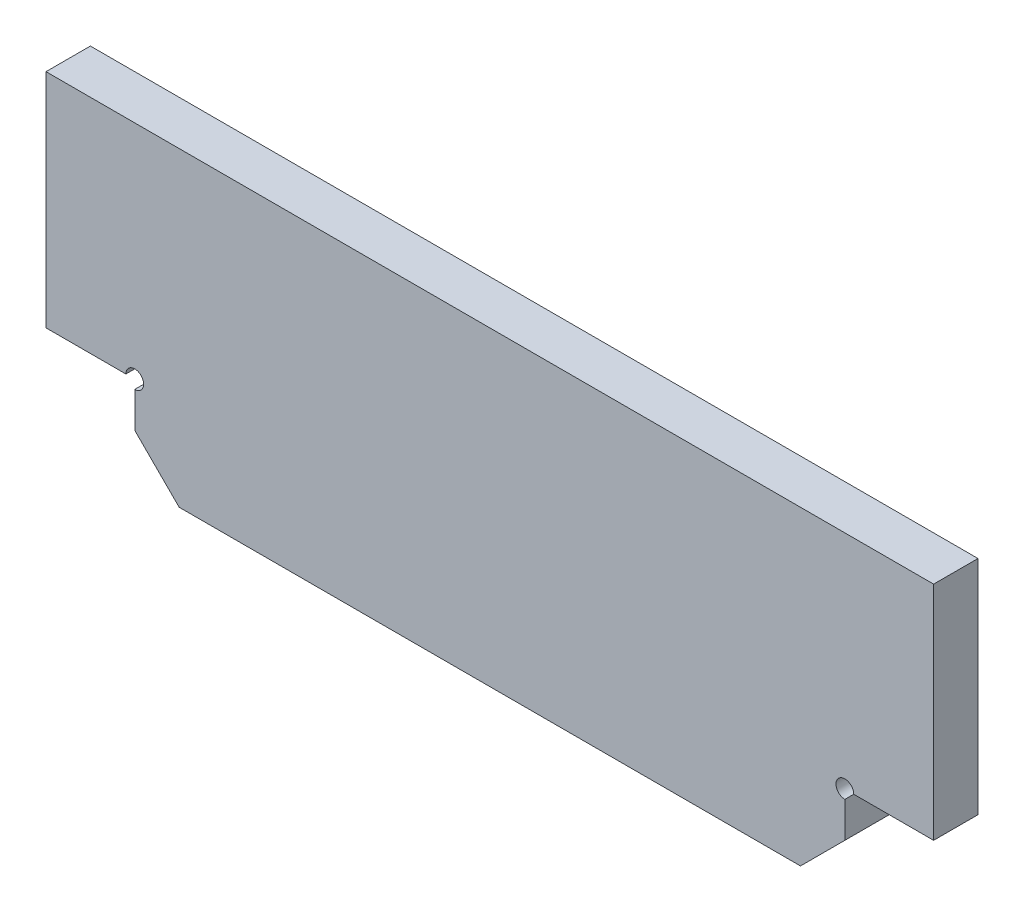
ISO-10303-21;
HEADER;
FILE_DESCRIPTION(('STEP AP214'),'2;1');
FILE_NAME('part.step','',(''),(''),'','','');
FILE_SCHEMA(('AUTOMOTIVE_DESIGN { 1 0 10303 214 1 1 1 1 }'));
ENDSEC;
DATA;
#1=APPLICATION_CONTEXT('core data for automotive mechanical design processes');
#2=APPLICATION_PROTOCOL_DEFINITION('international standard','automotive_design',2000,#1);
#3=PRODUCT_CONTEXT('',#1,'mechanical');
#4=PRODUCT('Part','Part','',(#3));
#5=PRODUCT_RELATED_PRODUCT_CATEGORY('part','',(#4));
#6=PRODUCT_DEFINITION_FORMATION('','',#4);
#7=PRODUCT_DEFINITION_CONTEXT('part definition',#1,'design');
#8=PRODUCT_DEFINITION('design','',#6,#7);
#9=PRODUCT_DEFINITION_SHAPE('','',#8);
#10=(LENGTH_UNIT() NAMED_UNIT(*) SI_UNIT(.MILLI.,.METRE.));
#11=(NAMED_UNIT(*) PLANE_ANGLE_UNIT() SI_UNIT($,.RADIAN.));
#12=(NAMED_UNIT(*) SI_UNIT($,.STERADIAN.) SOLID_ANGLE_UNIT());
#13=UNCERTAINTY_MEASURE_WITH_UNIT(LENGTH_MEASURE(1.E-05),#10,'distance_accuracy_value','');
#14=(GEOMETRIC_REPRESENTATION_CONTEXT(3) GLOBAL_UNCERTAINTY_ASSIGNED_CONTEXT((#13)) GLOBAL_UNIT_ASSIGNED_CONTEXT((#10,
#11,#12)) REPRESENTATION_CONTEXT('',''));
#15=CARTESIAN_POINT('',(0.,0.,0.));
#16=DIRECTION('',(0.,0.,1.));
#17=DIRECTION('',(1.,0.,0.));
#18=AXIS2_PLACEMENT_3D('',#15,#16,#17);
#19=CARTESIAN_POINT('',(50.,9.99999999999999,2.5));
#20=DIRECTION('',(-1.,0.,0.));
#21=DIRECTION('',(0.,0.,1.));
#22=AXIS2_PLACEMENT_3D('',#19,#20,#21);
#23=PLANE('',#22);
#24=DIRECTION('',(0.,1.,0.));
#25=VECTOR('',#24,1.);
#26=CARTESIAN_POINT('',(50.,9.99999999999999,-2.5));
#27=LINE('',#26,#25);
#28=CARTESIAN_POINT('',(50.,9.99999999999999,-2.5));
#29=VERTEX_POINT('',#28);
#30=CARTESIAN_POINT('',(50.,35.,-2.5));
#31=VERTEX_POINT('',#30);
#32=EDGE_CURVE('E152',#29,#31,#27,.T.);
#33=ORIENTED_EDGE('',*,*,#32,.T.);
#34=DIRECTION('',(0.,0.,-1.));
#35=VECTOR('',#34,1.);
#36=CARTESIAN_POINT('',(50.,35.,2.5));
#37=LINE('',#36,#35);
#38=CARTESIAN_POINT('',(50.,35.,2.5));
#39=VERTEX_POINT('',#38);
#40=EDGE_CURVE('E11',#39,#31,#37,.T.);
#41=ORIENTED_EDGE('',*,*,#40,.F.);
#42=DIRECTION('',(0.,1.,0.));
#43=VECTOR('',#42,1.);
#44=CARTESIAN_POINT('',(50.,9.99999999999999,2.5));
#45=LINE('',#44,#43);
#46=CARTESIAN_POINT('',(50.,9.99999999999999,2.5));
#47=VERTEX_POINT('',#46);
#48=EDGE_CURVE('E180',#47,#39,#45,.T.);
#49=ORIENTED_EDGE('',*,*,#48,.F.);
#50=DIRECTION('',(0.,0.,-1.));
#51=VECTOR('',#50,1.);
#52=CARTESIAN_POINT('',(50.,9.99999999999999,2.5));
#53=LINE('',#52,#51);
#54=EDGE_CURVE('E148',#47,#29,#53,.T.);
#55=ORIENTED_EDGE('',*,*,#54,.T.);
#56=EDGE_LOOP('',(#33,#41,#49,#55));
#57=FACE_BOUND('',#56,.T.);
#58=ADVANCED_FACE('F33',(#57),#23,.F.);
#59=CARTESIAN_POINT('',(50.,35.,2.5));
#60=DIRECTION('',(0.,-1.,0.));
#61=DIRECTION('',(0.,0.,-1.));
#62=AXIS2_PLACEMENT_3D('',#59,#60,#61);
#63=PLANE('',#62);
#64=DIRECTION('',(-1.,0.,0.));
#65=VECTOR('',#64,1.);
#66=CARTESIAN_POINT('',(50.,35.,-2.5));
#67=LINE('',#66,#65);
#68=CARTESIAN_POINT('',(-50.,35.,-2.5));
#69=VERTEX_POINT('',#68);
#70=EDGE_CURVE('E155',#31,#69,#67,.T.);
#71=ORIENTED_EDGE('',*,*,#70,.T.);
#72=DIRECTION('',(0.,0.,-1.));
#73=VECTOR('',#72,1.);
#74=CARTESIAN_POINT('',(-50.,35.,2.5));
#75=LINE('',#74,#73);
#76=CARTESIAN_POINT('',(-50.,35.,2.5));
#77=VERTEX_POINT('',#76);
#78=EDGE_CURVE('E41',#77,#69,#75,.T.);
#79=ORIENTED_EDGE('',*,*,#78,.F.);
#80=DIRECTION('',(-1.,0.,0.));
#81=VECTOR('',#80,1.);
#82=CARTESIAN_POINT('',(50.,35.,2.5));
#83=LINE('',#82,#81);
#84=EDGE_CURVE('E100',#39,#77,#83,.T.);
#85=ORIENTED_EDGE('',*,*,#84,.F.);
#86=ORIENTED_EDGE('',*,*,#40,.T.);
#87=EDGE_LOOP('',(#71,#79,#85,#86));
#88=FACE_BOUND('',#87,.T.);
#89=ADVANCED_FACE('F203',(#88),#63,.F.);
#90=CARTESIAN_POINT('',(-50.,10.,2.5));
#91=DIRECTION('',(-1.,0.,0.));
#92=DIRECTION('',(0.,0.,1.));
#93=AXIS2_PLACEMENT_3D('',#90,#91,#92);
#94=PLANE('',#93);
#95=DIRECTION('',(0.,1.,0.));
#96=VECTOR('',#95,1.);
#97=CARTESIAN_POINT('',(-50.,10.,-2.5));
#98=LINE('',#97,#96);
#99=CARTESIAN_POINT('',(-50.,10.,-2.5));
#100=VERTEX_POINT('',#99);
#101=EDGE_CURVE('E158',#100,#69,#98,.T.);
#102=ORIENTED_EDGE('',*,*,#101,.F.);
#103=DIRECTION('',(0.,0.,-1.));
#104=VECTOR('',#103,1.);
#105=CARTESIAN_POINT('',(-50.,10.,2.5));
#106=LINE('',#105,#104);
#107=CARTESIAN_POINT('',(-50.,10.,2.5));
#108=VERTEX_POINT('',#107);
#109=EDGE_CURVE('E196',#108,#100,#106,.T.);
#110=ORIENTED_EDGE('',*,*,#109,.F.);
#111=DIRECTION('',(0.,1.,0.));
#112=VECTOR('',#111,1.);
#113=CARTESIAN_POINT('',(-50.,10.,2.5));
#114=LINE('',#113,#112);
#115=EDGE_CURVE('E202',#108,#77,#114,.T.);
#116=ORIENTED_EDGE('',*,*,#115,.T.);
#117=ORIENTED_EDGE('',*,*,#78,.T.);
#118=EDGE_LOOP('',(#102,#110,#116,#117));
#119=FACE_BOUND('',#118,.T.);
#120=ADVANCED_FACE('F200',(#119),#94,.T.);
#121=CARTESIAN_POINT('',(-41.,10.,2.5));
#122=DIRECTION('',(0.,-1.,0.));
#123=DIRECTION('',(0.,0.,-1.));
#124=AXIS2_PLACEMENT_3D('',#121,#122,#123);
#125=PLANE('',#124);
#126=DIRECTION('',(-1.,0.,0.));
#127=VECTOR('',#126,1.);
#128=CARTESIAN_POINT('',(-41.,10.,-2.5));
#129=LINE('',#128,#127);
#130=CARTESIAN_POINT('',(-41.,10.,-2.5));
#131=VERTEX_POINT('',#130);
#132=EDGE_CURVE('E161',#131,#100,#129,.T.);
#133=ORIENTED_EDGE('',*,*,#132,.F.);
#134=DIRECTION('',(0.,0.,-1.));
#135=VECTOR('',#134,1.);
#136=CARTESIAN_POINT('',(-41.,10.,2.5));
#137=LINE('',#136,#135);
#138=CARTESIAN_POINT('',(-41.,10.,2.5));
#139=VERTEX_POINT('',#138);
#140=EDGE_CURVE('E194',#139,#131,#137,.T.);
#141=ORIENTED_EDGE('',*,*,#140,.F.);
#142=DIRECTION('',(-1.,0.,0.));
#143=VECTOR('',#142,1.);
#144=CARTESIAN_POINT('',(-41.,10.,2.5));
#145=LINE('',#144,#143);
#146=EDGE_CURVE('E214',#139,#108,#145,.T.);
#147=ORIENTED_EDGE('',*,*,#146,.T.);
#148=ORIENTED_EDGE('',*,*,#109,.T.);
#149=EDGE_LOOP('',(#133,#141,#147,#148));
#150=FACE_BOUND('',#149,.T.);
#151=ADVANCED_FACE('F211',(#150),#125,.T.);
#152=CARTESIAN_POINT('',(-40.,10.,2.5));
#153=DIRECTION('',(0.,0.,-1.));
#154=DIRECTION('',(-1.,0.,0.));
#155=AXIS2_PLACEMENT_3D('',#152,#153,#154);
#156=CYLINDRICAL_SURFACE('',#155,1.);
#157=CARTESIAN_POINT('',(-40.,10.,-2.5));
#158=DIRECTION('',(0.,0.,1.));
#159=DIRECTION('',(1.,0.,0.));
#160=AXIS2_PLACEMENT_3D('',#157,#158,#159);
#161=CIRCLE('',#160,1.);
#162=CARTESIAN_POINT('',(-40.,9.00000000000001,-2.5));
#163=VERTEX_POINT('',#162);
#164=EDGE_CURVE('E164',#163,#131,#161,.T.);
#165=ORIENTED_EDGE('',*,*,#164,.F.);
#166=DIRECTION('',(0.,0.,-1.));
#167=VECTOR('',#166,1.);
#168=CARTESIAN_POINT('',(-40.,9.00000000000001,2.5));
#169=LINE('',#168,#167);
#170=CARTESIAN_POINT('',(-40.,9.00000000000001,2.5));
#171=VERTEX_POINT('',#170);
#172=EDGE_CURVE('E192',#171,#163,#169,.T.);
#173=ORIENTED_EDGE('',*,*,#172,.F.);
#174=CARTESIAN_POINT('',(-40.,10.,2.5));
#175=DIRECTION('',(0.,0.,1.));
#176=DIRECTION('',(1.,0.,0.));
#177=AXIS2_PLACEMENT_3D('',#174,#175,#176);
#178=CIRCLE('',#177,1.);
#179=EDGE_CURVE('E218',#171,#139,#178,.T.);
#180=ORIENTED_EDGE('',*,*,#179,.T.);
#181=ORIENTED_EDGE('',*,*,#140,.T.);
#182=EDGE_LOOP('',(#165,#173,#180,#181));
#183=FACE_BOUND('',#182,.T.);
#184=ADVANCED_FACE('F264',(#183),#156,.F.);
#185=CARTESIAN_POINT('',(-40.,5.,2.5));
#186=DIRECTION('',(-1.,0.,0.));
#187=DIRECTION('',(0.,0.,1.));
#188=AXIS2_PLACEMENT_3D('',#185,#186,#187);
#189=PLANE('',#188);
#190=DIRECTION('',(0.,1.,0.));
#191=VECTOR('',#190,1.);
#192=CARTESIAN_POINT('',(-40.,5.,-2.5));
#193=LINE('',#192,#191);
#194=CARTESIAN_POINT('',(-40.,5.,-2.5));
#195=VERTEX_POINT('',#194);
#196=EDGE_CURVE('E167',#195,#163,#193,.T.);
#197=ORIENTED_EDGE('',*,*,#196,.F.);
#198=DIRECTION('',(0.,0.,-1.));
#199=VECTOR('',#198,1.);
#200=CARTESIAN_POINT('',(-40.,5.,2.5));
#201=LINE('',#200,#199);
#202=CARTESIAN_POINT('',(-40.,5.,2.5));
#203=VERTEX_POINT('',#202);
#204=EDGE_CURVE('E190',#203,#195,#201,.T.);
#205=ORIENTED_EDGE('',*,*,#204,.F.);
#206=DIRECTION('',(0.,1.,0.));
#207=VECTOR('',#206,1.);
#208=CARTESIAN_POINT('',(-40.,5.,2.5));
#209=LINE('',#208,#207);
#210=EDGE_CURVE('E224',#203,#171,#209,.T.);
#211=ORIENTED_EDGE('',*,*,#210,.T.);
#212=ORIENTED_EDGE('',*,*,#172,.T.);
#213=EDGE_LOOP('',(#197,#205,#211,#212));
#214=FACE_BOUND('',#213,.T.);
#215=ADVANCED_FACE('F267',(#214),#189,.T.);
#216=CARTESIAN_POINT('',(-40.,5.,2.5));
#217=DIRECTION('',(0.707106781186547,0.707106781186548,0.));
#218=DIRECTION('',(-0.707106781186548,0.707106781186547,0.));
#219=AXIS2_PLACEMENT_3D('',#216,#217,#218);
#220=PLANE('',#219);
#221=DIRECTION('',(0.707106781186548,-0.707106781186547,0.));
#222=VECTOR('',#221,1.);
#223=CARTESIAN_POINT('',(-40.,5.,-2.5));
#224=LINE('',#223,#222);
#225=CARTESIAN_POINT('',(-35.,0.,-2.5));
#226=VERTEX_POINT('',#225);
#227=EDGE_CURVE('E170',#195,#226,#224,.T.);
#228=ORIENTED_EDGE('',*,*,#227,.T.);
#229=DIRECTION('',(0.,0.,-1.));
#230=VECTOR('',#229,1.);
#231=CARTESIAN_POINT('',(-35.,0.,2.5));
#232=LINE('',#231,#230);
#233=CARTESIAN_POINT('',(-35.,0.,2.5));
#234=VERTEX_POINT('',#233);
#235=EDGE_CURVE('E187',#234,#226,#232,.T.);
#236=ORIENTED_EDGE('',*,*,#235,.F.);
#237=DIRECTION('',(0.707106781186548,-0.707106781186547,0.));
#238=VECTOR('',#237,1.);
#239=CARTESIAN_POINT('',(-40.,5.,2.5));
#240=LINE('',#239,#238);
#241=EDGE_CURVE('E227',#203,#234,#240,.T.);
#242=ORIENTED_EDGE('',*,*,#241,.F.);
#243=ORIENTED_EDGE('',*,*,#204,.T.);
#244=EDGE_LOOP('',(#228,#236,#242,#243));
#245=FACE_BOUND('',#244,.T.);
#246=ADVANCED_FACE('F271',(#245),#220,.F.);
#247=CARTESIAN_POINT('',(-35.,0.,2.5));
#248=DIRECTION('',(0.,1.,0.));
#249=DIRECTION('',(-1.,0.,0.));
#250=AXIS2_PLACEMENT_3D('',#247,#248,#249);
#251=PLANE('',#250);
#252=DIRECTION('',(1.,0.,0.));
#253=VECTOR('',#252,1.);
#254=CARTESIAN_POINT('',(-35.,0.,-2.5));
#255=LINE('',#254,#253);
#256=CARTESIAN_POINT('',(35.,0.,-2.5));
#257=VERTEX_POINT('',#256);
#258=EDGE_CURVE('E172',#226,#257,#255,.T.);
#259=ORIENTED_EDGE('',*,*,#258,.T.);
#260=DIRECTION('',(0.,0.,-1.));
#261=VECTOR('',#260,1.);
#262=CARTESIAN_POINT('',(35.,0.,2.5));
#263=LINE('',#262,#261);
#264=CARTESIAN_POINT('',(35.,0.,2.5));
#265=VERTEX_POINT('',#264);
#266=EDGE_CURVE('E184',#265,#257,#263,.T.);
#267=ORIENTED_EDGE('',*,*,#266,.F.);
#268=DIRECTION('',(1.,0.,0.));
#269=VECTOR('',#268,1.);
#270=CARTESIAN_POINT('',(-35.,0.,2.5));
#271=LINE('',#270,#269);
#272=EDGE_CURVE('E229',#234,#265,#271,.T.);
#273=ORIENTED_EDGE('',*,*,#272,.F.);
#274=ORIENTED_EDGE('',*,*,#235,.T.);
#275=EDGE_LOOP('',(#259,#267,#273,#274));
#276=FACE_BOUND('',#275,.T.);
#277=ADVANCED_FACE('F236',(#276),#251,.F.);
#278=CARTESIAN_POINT('',(35.,0.,2.5));
#279=DIRECTION('',(-0.707106781186546,0.707106781186549,0.));
#280=DIRECTION('',(-0.707106781186549,-0.707106781186546,0.));
#281=AXIS2_PLACEMENT_3D('',#278,#279,#280);
#282=PLANE('',#281);
#283=DIRECTION('',(0.707106781186549,0.707106781186546,0.));
#284=VECTOR('',#283,1.);
#285=CARTESIAN_POINT('',(35.,0.,-2.5));
#286=LINE('',#285,#284);
#287=CARTESIAN_POINT('',(40.,4.99999999999999,-2.5));
#288=VERTEX_POINT('',#287);
#289=EDGE_CURVE('E174',#257,#288,#286,.T.);
#290=ORIENTED_EDGE('',*,*,#289,.T.);
#291=DIRECTION('',(0.,0.,-1.));
#292=VECTOR('',#291,1.);
#293=CARTESIAN_POINT('',(40.,4.99999999999999,2.5));
#294=LINE('',#293,#292);
#295=CARTESIAN_POINT('',(40.,4.99999999999999,2.5));
#296=VERTEX_POINT('',#295);
#297=EDGE_CURVE('E144',#296,#288,#294,.T.);
#298=ORIENTED_EDGE('',*,*,#297,.F.);
#299=DIRECTION('',(0.707106781186549,0.707106781186546,0.));
#300=VECTOR('',#299,1.);
#301=CARTESIAN_POINT('',(35.,0.,2.5));
#302=LINE('',#301,#300);
#303=EDGE_CURVE('E131',#265,#296,#302,.T.);
#304=ORIENTED_EDGE('',*,*,#303,.F.);
#305=ORIENTED_EDGE('',*,*,#266,.T.);
#306=EDGE_LOOP('',(#290,#298,#304,#305));
#307=FACE_BOUND('',#306,.T.);
#308=ADVANCED_FACE('F240',(#307),#282,.F.);
#309=CARTESIAN_POINT('',(40.,4.99999999999999,2.5));
#310=DIRECTION('',(-1.,0.,0.));
#311=DIRECTION('',(0.,0.,1.));
#312=AXIS2_PLACEMENT_3D('',#309,#310,#311);
#313=PLANE('',#312);
#314=DIRECTION('',(0.,1.,0.));
#315=VECTOR('',#314,1.);
#316=CARTESIAN_POINT('',(40.,4.99999999999999,-2.5));
#317=LINE('',#316,#315);
#318=CARTESIAN_POINT('',(40.,9.,-2.5));
#319=VERTEX_POINT('',#318);
#320=EDGE_CURVE('E140',#288,#319,#317,.T.);
#321=ORIENTED_EDGE('',*,*,#320,.T.);
#322=DIRECTION('',(0.,0.,-1.));
#323=VECTOR('',#322,1.);
#324=CARTESIAN_POINT('',(40.,9.,2.5));
#325=LINE('',#324,#323);
#326=CARTESIAN_POINT('',(40.,9.,2.5));
#327=VERTEX_POINT('',#326);
#328=EDGE_CURVE('E137',#327,#319,#325,.T.);
#329=ORIENTED_EDGE('',*,*,#328,.F.);
#330=DIRECTION('',(0.,1.,0.));
#331=VECTOR('',#330,1.);
#332=CARTESIAN_POINT('',(40.,4.99999999999999,2.5));
#333=LINE('',#332,#331);
#334=EDGE_CURVE('E125',#296,#327,#333,.T.);
#335=ORIENTED_EDGE('',*,*,#334,.F.);
#336=ORIENTED_EDGE('',*,*,#297,.T.);
#337=EDGE_LOOP('',(#321,#329,#335,#336));
#338=FACE_BOUND('',#337,.T.);
#339=ADVANCED_FACE('F138',(#338),#313,.F.);
#340=CARTESIAN_POINT('',(40.,9.99999999999999,2.5));
#341=DIRECTION('',(0.,0.,-1.));
#342=DIRECTION('',(-1.,0.,0.));
#343=AXIS2_PLACEMENT_3D('',#340,#341,#342);
#344=CYLINDRICAL_SURFACE('',#343,0.999999999999999);
#345=CARTESIAN_POINT('',(40.,9.99999999999999,-2.5));
#346=DIRECTION('',(0.,0.,1.));
#347=DIRECTION('',(1.,0.,0.));
#348=AXIS2_PLACEMENT_3D('',#345,#346,#347);
#349=CIRCLE('',#348,0.999999999999999);
#350=CARTESIAN_POINT('',(41.,9.99999999999999,-2.5));
#351=VERTEX_POINT('',#350);
#352=EDGE_CURVE('E177',#351,#319,#349,.T.);
#353=ORIENTED_EDGE('',*,*,#352,.F.);
#354=DIRECTION('',(0.,0.,-1.));
#355=VECTOR('',#354,1.);
#356=CARTESIAN_POINT('',(41.,9.99999999999999,2.5));
#357=LINE('',#356,#355);
#358=CARTESIAN_POINT('',(41.,9.99999999999999,2.5));
#359=VERTEX_POINT('',#358);
#360=EDGE_CURVE('E89',#359,#351,#357,.T.);
#361=ORIENTED_EDGE('',*,*,#360,.F.);
#362=CARTESIAN_POINT('',(40.,9.99999999999999,2.5));
#363=DIRECTION('',(0.,0.,1.));
#364=DIRECTION('',(1.,0.,0.));
#365=AXIS2_PLACEMENT_3D('',#362,#363,#364);
#366=CIRCLE('',#365,0.999999999999999);
#367=EDGE_CURVE('E129',#359,#327,#366,.T.);
#368=ORIENTED_EDGE('',*,*,#367,.T.);
#369=ORIENTED_EDGE('',*,*,#328,.T.);
#370=EDGE_LOOP('',(#353,#361,#368,#369));
#371=FACE_BOUND('',#370,.T.);
#372=ADVANCED_FACE('F146',(#371),#344,.F.);
#373=CARTESIAN_POINT('',(41.,9.99999999999999,2.5));
#374=DIRECTION('',(0.,1.,0.));
#375=DIRECTION('',(0.,0.,1.));
#376=AXIS2_PLACEMENT_3D('',#373,#374,#375);
#377=PLANE('',#376);
#378=DIRECTION('',(1.,0.,0.));
#379=VECTOR('',#378,1.);
#380=CARTESIAN_POINT('',(41.,9.99999999999999,-2.5));
#381=LINE('',#380,#379);
#382=EDGE_CURVE('E92',#351,#29,#381,.T.);
#383=ORIENTED_EDGE('',*,*,#382,.T.);
#384=ORIENTED_EDGE('',*,*,#54,.F.);
#385=DIRECTION('',(1.,0.,0.));
#386=VECTOR('',#385,1.);
#387=CARTESIAN_POINT('',(41.,9.99999999999999,2.5));
#388=LINE('',#387,#386);
#389=EDGE_CURVE('E49',#359,#47,#388,.T.);
#390=ORIENTED_EDGE('',*,*,#389,.F.);
#391=ORIENTED_EDGE('',*,*,#360,.T.);
#392=EDGE_LOOP('',(#383,#384,#390,#391));
#393=FACE_BOUND('',#392,.T.);
#394=ADVANCED_FACE('F243',(#393),#377,.F.);
#395=CARTESIAN_POINT('',(-40.,10.,2.5));
#396=DIRECTION('',(0.,0.,1.));
#397=DIRECTION('',(1.,0.,0.));
#398=AXIS2_PLACEMENT_3D('',#395,#396,#397);
#399=PLANE('',#398);
#400=ORIENTED_EDGE('',*,*,#48,.T.);
#401=ORIENTED_EDGE('',*,*,#84,.T.);
#402=ORIENTED_EDGE('',*,*,#115,.F.);
#403=ORIENTED_EDGE('',*,*,#146,.F.);
#404=ORIENTED_EDGE('',*,*,#179,.F.);
#405=ORIENTED_EDGE('',*,*,#210,.F.);
#406=ORIENTED_EDGE('',*,*,#241,.T.);
#407=ORIENTED_EDGE('',*,*,#272,.T.);
#408=ORIENTED_EDGE('',*,*,#303,.T.);
#409=ORIENTED_EDGE('',*,*,#334,.T.);
#410=ORIENTED_EDGE('',*,*,#367,.F.);
#411=ORIENTED_EDGE('',*,*,#389,.T.);
#412=EDGE_LOOP('',(#400,#401,#402,#403,#404,#405,#406,#407,#408,#409,#410,#411));
#413=FACE_BOUND('',#412,.T.);
#414=ADVANCED_FACE('F127',(#413),#399,.T.);
#415=CARTESIAN_POINT('',(-40.,10.,-2.5));
#416=DIRECTION('',(0.,0.,1.));
#417=DIRECTION('',(1.,0.,0.));
#418=AXIS2_PLACEMENT_3D('',#415,#416,#417);
#419=PLANE('',#418);
#420=ORIENTED_EDGE('',*,*,#32,.F.);
#421=ORIENTED_EDGE('',*,*,#382,.F.);
#422=ORIENTED_EDGE('',*,*,#352,.T.);
#423=ORIENTED_EDGE('',*,*,#320,.F.);
#424=ORIENTED_EDGE('',*,*,#289,.F.);
#425=ORIENTED_EDGE('',*,*,#258,.F.);
#426=ORIENTED_EDGE('',*,*,#227,.F.);
#427=ORIENTED_EDGE('',*,*,#196,.T.);
#428=ORIENTED_EDGE('',*,*,#164,.T.);
#429=ORIENTED_EDGE('',*,*,#132,.T.);
#430=ORIENTED_EDGE('',*,*,#101,.T.);
#431=ORIENTED_EDGE('',*,*,#70,.F.);
#432=EDGE_LOOP('',(#420,#421,#422,#423,#424,#425,#426,#427,#428,#429,#430,#431));
#433=FACE_BOUND('',#432,.T.);
#434=ADVANCED_FACE('F207',(#433),#419,.F.);
#435=CLOSED_SHELL('',(#58,#89,#120,#151,#184,#215,#246,#277,#308,#339,#372,#394,#414,#434));
#436=MANIFOLD_SOLID_BREP('B2',#435);
#437=ADVANCED_BREP_SHAPE_REPRESENTATION('',(#18,#436),#14);
#438=SHAPE_DEFINITION_REPRESENTATION(#9,#437);
ENDSEC;
END-ISO-10303-21;
